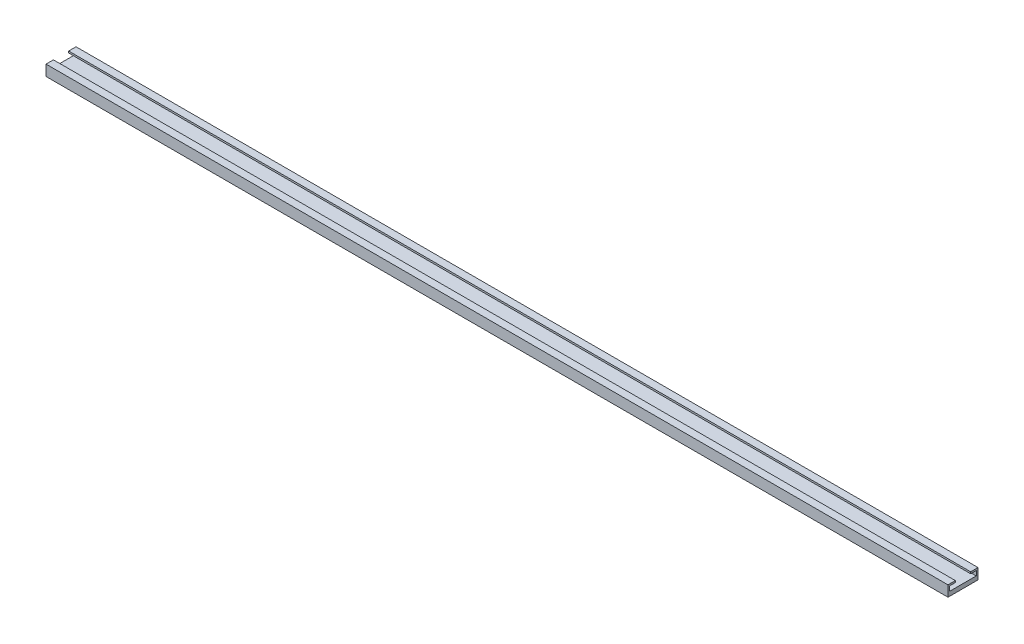
ISO-10303-21;
HEADER;
FILE_DESCRIPTION(('STEP AP214'),'2;1');
FILE_NAME('part.step','',(''),(''),'','','');
FILE_SCHEMA(('AUTOMOTIVE_DESIGN { 1 0 10303 214 1 1 1 1 }'));
ENDSEC;
DATA;
#1=APPLICATION_CONTEXT('core data for automotive mechanical design processes');
#2=APPLICATION_PROTOCOL_DEFINITION('international standard','automotive_design',2000,#1);
#3=PRODUCT_CONTEXT('',#1,'mechanical');
#4=PRODUCT('Part','Part','',(#3));
#5=PRODUCT_RELATED_PRODUCT_CATEGORY('part','',(#4));
#6=PRODUCT_DEFINITION_FORMATION('','',#4);
#7=PRODUCT_DEFINITION_CONTEXT('part definition',#1,'design');
#8=PRODUCT_DEFINITION('design','',#6,#7);
#9=PRODUCT_DEFINITION_SHAPE('','',#8);
#10=(LENGTH_UNIT() NAMED_UNIT(*) SI_UNIT(.MILLI.,.METRE.));
#11=(NAMED_UNIT(*) PLANE_ANGLE_UNIT() SI_UNIT($,.RADIAN.));
#12=(NAMED_UNIT(*) SI_UNIT($,.STERADIAN.) SOLID_ANGLE_UNIT());
#13=UNCERTAINTY_MEASURE_WITH_UNIT(LENGTH_MEASURE(1.E-05),#10,'distance_accuracy_value','');
#14=(GEOMETRIC_REPRESENTATION_CONTEXT(3) GLOBAL_UNCERTAINTY_ASSIGNED_CONTEXT((#13)) GLOBAL_UNIT_ASSIGNED_CONTEXT((#10,
#11,#12)) REPRESENTATION_CONTEXT('',''));
#15=CARTESIAN_POINT('',(0.,0.,0.));
#16=DIRECTION('',(0.,0.,1.));
#17=DIRECTION('',(1.,0.,0.));
#18=AXIS2_PLACEMENT_3D('',#15,#16,#17);
#19=CARTESIAN_POINT('',(1000.,3.7,4.4));
#20=DIRECTION('',(0.,-1.,0.));
#21=DIRECTION('',(0.,0.,-1.));
#22=AXIS2_PLACEMENT_3D('',#19,#20,#21);
#23=PLANE('',#22);
#24=DIRECTION('',(-1.,0.,0.));
#25=VECTOR('',#24,1.);
#26=CARTESIAN_POINT('',(1000.,3.7,8.65));
#27=LINE('',#26,#25);
#28=CARTESIAN_POINT('',(0.,3.7,8.65));
#29=VERTEX_POINT('',#28);
#30=CARTESIAN_POINT('',(-520.,3.7,8.65));
#31=VERTEX_POINT('',#30);
#32=EDGE_CURVE('E57',#29,#31,#27,.T.);
#33=ORIENTED_EDGE('',*,*,#32,.F.);
#34=DIRECTION('',(0.,0.,-1.));
#35=VECTOR('',#34,1.);
#36=CARTESIAN_POINT('',(0.,3.7,4.4));
#37=LINE('',#36,#35);
#38=CARTESIAN_POINT('',(0.,3.7,4.4));
#39=VERTEX_POINT('',#38);
#40=EDGE_CURVE('E263',#29,#39,#37,.T.);
#41=ORIENTED_EDGE('',*,*,#40,.T.);
#42=DIRECTION('',(-1.,0.,0.));
#43=VECTOR('',#42,1.);
#44=CARTESIAN_POINT('',(1000.,3.7,4.4));
#45=LINE('',#44,#43);
#46=CARTESIAN_POINT('',(-520.,3.7,4.4));
#47=VERTEX_POINT('',#46);
#48=EDGE_CURVE('E206',#39,#47,#45,.T.);
#49=ORIENTED_EDGE('',*,*,#48,.T.);
#50=DIRECTION('',(0.,0.,-1.));
#51=VECTOR('',#50,1.);
#52=CARTESIAN_POINT('',(-520.,3.7,8.65));
#53=LINE('',#52,#51);
#54=EDGE_CURVE('E257',#31,#47,#53,.T.);
#55=ORIENTED_EDGE('',*,*,#54,.F.);
#56=EDGE_LOOP('',(#33,#41,#49,#55));
#57=FACE_BOUND('',#56,.T.);
#58=ADVANCED_FACE('F53',(#57),#23,.F.);
#59=CARTESIAN_POINT('',(1000.,3.7,8.65));
#60=DIRECTION('',(0.,0.,-1.));
#61=DIRECTION('',(-1.,0.,0.));
#62=AXIS2_PLACEMENT_3D('',#59,#60,#61);
#63=PLANE('',#62);
#64=DIRECTION('',(-1.,0.,0.));
#65=VECTOR('',#64,1.);
#66=CARTESIAN_POINT('',(1000.,-2.5,8.65));
#67=LINE('',#66,#65);
#68=CARTESIAN_POINT('',(0.,-2.5,8.65));
#69=VERTEX_POINT('',#68);
#70=CARTESIAN_POINT('',(-520.,-2.5,8.65));
#71=VERTEX_POINT('',#70);
#72=EDGE_CURVE('E78',#69,#71,#67,.T.);
#73=ORIENTED_EDGE('',*,*,#72,.F.);
#74=DIRECTION('',(0.,1.,0.));
#75=VECTOR('',#74,1.);
#76=CARTESIAN_POINT('',(0.,3.7,8.65));
#77=LINE('',#76,#75);
#78=EDGE_CURVE('E72',#69,#29,#77,.T.);
#79=ORIENTED_EDGE('',*,*,#78,.T.);
#80=ORIENTED_EDGE('',*,*,#32,.T.);
#81=DIRECTION('',(0.,1.,0.));
#82=VECTOR('',#81,1.);
#83=CARTESIAN_POINT('',(-520.,-2.5,8.65));
#84=LINE('',#83,#82);
#85=EDGE_CURVE('E260',#71,#31,#84,.T.);
#86=ORIENTED_EDGE('',*,*,#85,.F.);
#87=EDGE_LOOP('',(#73,#79,#80,#86));
#88=FACE_BOUND('',#87,.T.);
#89=ADVANCED_FACE('F331',(#88),#63,.F.);
#90=CARTESIAN_POINT('',(1000.,2.7,4.4));
#91=DIRECTION('',(0.,0.,1.));
#92=DIRECTION('',(1.,0.,0.));
#93=AXIS2_PLACEMENT_3D('',#90,#91,#92);
#94=PLANE('',#93);
#95=ORIENTED_EDGE('',*,*,#48,.F.);
#96=DIRECTION('',(0.,-1.,0.));
#97=VECTOR('',#96,1.);
#98=CARTESIAN_POINT('',(0.,2.7,4.4));
#99=LINE('',#98,#97);
#100=CARTESIAN_POINT('',(0.,2.7,4.4));
#101=VERTEX_POINT('',#100);
#102=EDGE_CURVE('E268',#39,#101,#99,.T.);
#103=ORIENTED_EDGE('',*,*,#102,.T.);
#104=DIRECTION('',(-1.,0.,0.));
#105=VECTOR('',#104,1.);
#106=CARTESIAN_POINT('',(1000.,2.7,4.4));
#107=LINE('',#106,#105);
#108=CARTESIAN_POINT('',(-520.,2.7,4.4));
#109=VERTEX_POINT('',#108);
#110=EDGE_CURVE('E197',#101,#109,#107,.T.);
#111=ORIENTED_EDGE('',*,*,#110,.T.);
#112=DIRECTION('',(0.,-1.,0.));
#113=VECTOR('',#112,1.);
#114=CARTESIAN_POINT('',(-520.,3.7,4.4));
#115=LINE('',#114,#113);
#116=EDGE_CURVE('E253',#47,#109,#115,.T.);
#117=ORIENTED_EDGE('',*,*,#116,.F.);
#118=EDGE_LOOP('',(#95,#103,#111,#117));
#119=FACE_BOUND('',#118,.T.);
#120=ADVANCED_FACE('F320',(#119),#94,.F.);
#121=CARTESIAN_POINT('',(1000.,2.7,7.65));
#122=DIRECTION('',(0.,1.,0.));
#123=DIRECTION('',(0.,0.,1.));
#124=AXIS2_PLACEMENT_3D('',#121,#122,#123);
#125=PLANE('',#124);
#126=ORIENTED_EDGE('',*,*,#110,.F.);
#127=DIRECTION('',(0.,0.,1.));
#128=VECTOR('',#127,1.);
#129=CARTESIAN_POINT('',(0.,2.7,7.65));
#130=LINE('',#129,#128);
#131=CARTESIAN_POINT('',(0.,2.7,7.65));
#132=VERTEX_POINT('',#131);
#133=EDGE_CURVE('E272',#101,#132,#130,.T.);
#134=ORIENTED_EDGE('',*,*,#133,.T.);
#135=DIRECTION('',(-1.,0.,0.));
#136=VECTOR('',#135,1.);
#137=CARTESIAN_POINT('',(1000.,2.7,7.65));
#138=LINE('',#137,#136);
#139=CARTESIAN_POINT('',(-520.,2.7,7.65));
#140=VERTEX_POINT('',#139);
#141=EDGE_CURVE('E194',#132,#140,#138,.T.);
#142=ORIENTED_EDGE('',*,*,#141,.T.);
#143=DIRECTION('',(0.,0.,1.));
#144=VECTOR('',#143,1.);
#145=CARTESIAN_POINT('',(-520.,2.7,4.4));
#146=LINE('',#145,#144);
#147=EDGE_CURVE('E249',#109,#140,#146,.T.);
#148=ORIENTED_EDGE('',*,*,#147,.F.);
#149=EDGE_LOOP('',(#126,#134,#142,#148));
#150=FACE_BOUND('',#149,.T.);
#151=ADVANCED_FACE('F324',(#150),#125,.F.);
#152=CARTESIAN_POINT('',(1000.,0.,7.65));
#153=DIRECTION('',(0.,0.,1.));
#154=DIRECTION('',(1.,0.,0.));
#155=AXIS2_PLACEMENT_3D('',#152,#153,#154);
#156=PLANE('',#155);
#157=ORIENTED_EDGE('',*,*,#141,.F.);
#158=DIRECTION('',(0.,-1.,0.));
#159=VECTOR('',#158,1.);
#160=CARTESIAN_POINT('',(0.,0.,7.65));
#161=LINE('',#160,#159);
#162=CARTESIAN_POINT('',(0.,0.,7.65));
#163=VERTEX_POINT('',#162);
#164=EDGE_CURVE('E276',#132,#163,#161,.T.);
#165=ORIENTED_EDGE('',*,*,#164,.T.);
#166=DIRECTION('',(-1.,0.,0.));
#167=VECTOR('',#166,1.);
#168=CARTESIAN_POINT('',(1000.,0.,7.65));
#169=LINE('',#168,#167);
#170=CARTESIAN_POINT('',(-520.,0.,7.65));
#171=VERTEX_POINT('',#170);
#172=EDGE_CURVE('E191',#163,#171,#169,.T.);
#173=ORIENTED_EDGE('',*,*,#172,.T.);
#174=DIRECTION('',(0.,-1.,0.));
#175=VECTOR('',#174,1.);
#176=CARTESIAN_POINT('',(-520.,2.7,7.65));
#177=LINE('',#176,#175);
#178=EDGE_CURVE('E245',#140,#171,#177,.T.);
#179=ORIENTED_EDGE('',*,*,#178,.F.);
#180=EDGE_LOOP('',(#157,#165,#173,#179));
#181=FACE_BOUND('',#180,.T.);
#182=ADVANCED_FACE('F327',(#181),#156,.F.);
#183=CARTESIAN_POINT('',(1000.,0.,-7.65));
#184=DIRECTION('',(0.,-1.,0.));
#185=DIRECTION('',(0.,0.,-1.));
#186=AXIS2_PLACEMENT_3D('',#183,#184,#185);
#187=PLANE('',#186);
#188=ORIENTED_EDGE('',*,*,#172,.F.);
#189=DIRECTION('',(0.,0.,-1.));
#190=VECTOR('',#189,1.);
#191=CARTESIAN_POINT('',(0.,0.,-7.65));
#192=LINE('',#191,#190);
#193=CARTESIAN_POINT('',(0.,0.,-7.65));
#194=VERTEX_POINT('',#193);
#195=EDGE_CURVE('E280',#163,#194,#192,.T.);
#196=ORIENTED_EDGE('',*,*,#195,.T.);
#197=DIRECTION('',(-1.,0.,0.));
#198=VECTOR('',#197,1.);
#199=CARTESIAN_POINT('',(1000.,0.,-7.65));
#200=LINE('',#199,#198);
#201=CARTESIAN_POINT('',(-520.,0.,-7.65));
#202=VERTEX_POINT('',#201);
#203=EDGE_CURVE('E188',#194,#202,#200,.T.);
#204=ORIENTED_EDGE('',*,*,#203,.T.);
#205=DIRECTION('',(0.,0.,-1.));
#206=VECTOR('',#205,1.);
#207=CARTESIAN_POINT('',(-520.,0.,7.65));
#208=LINE('',#207,#206);
#209=EDGE_CURVE('E241',#171,#202,#208,.T.);
#210=ORIENTED_EDGE('',*,*,#209,.F.);
#211=EDGE_LOOP('',(#188,#196,#204,#210));
#212=FACE_BOUND('',#211,.T.);
#213=ADVANCED_FACE('F330',(#212),#187,.F.);
#214=CARTESIAN_POINT('',(1000.,2.7,-7.65));
#215=DIRECTION('',(0.,0.,-1.));
#216=DIRECTION('',(-1.,0.,0.));
#217=AXIS2_PLACEMENT_3D('',#214,#215,#216);
#218=PLANE('',#217);
#219=ORIENTED_EDGE('',*,*,#203,.F.);
#220=DIRECTION('',(0.,1.,0.));
#221=VECTOR('',#220,1.);
#222=CARTESIAN_POINT('',(0.,2.7,-7.65));
#223=LINE('',#222,#221);
#224=CARTESIAN_POINT('',(0.,2.7,-7.65));
#225=VERTEX_POINT('',#224);
#226=EDGE_CURVE('E284',#194,#225,#223,.T.);
#227=ORIENTED_EDGE('',*,*,#226,.T.);
#228=DIRECTION('',(-1.,0.,0.));
#229=VECTOR('',#228,1.);
#230=CARTESIAN_POINT('',(1000.,2.7,-7.65));
#231=LINE('',#230,#229);
#232=CARTESIAN_POINT('',(-520.,2.7,-7.65));
#233=VERTEX_POINT('',#232);
#234=EDGE_CURVE('E178',#225,#233,#231,.T.);
#235=ORIENTED_EDGE('',*,*,#234,.T.);
#236=DIRECTION('',(0.,1.,0.));
#237=VECTOR('',#236,1.);
#238=CARTESIAN_POINT('',(-520.,0.,-7.65));
#239=LINE('',#238,#237);
#240=EDGE_CURVE('E237',#202,#233,#239,.T.);
#241=ORIENTED_EDGE('',*,*,#240,.F.);
#242=EDGE_LOOP('',(#219,#227,#235,#241));
#243=FACE_BOUND('',#242,.T.);
#244=ADVANCED_FACE('F314',(#243),#218,.F.);
#245=CARTESIAN_POINT('',(1000.,2.7,-4.4));
#246=DIRECTION('',(0.,1.,0.));
#247=DIRECTION('',(0.,0.,1.));
#248=AXIS2_PLACEMENT_3D('',#245,#246,#247);
#249=PLANE('',#248);
#250=ORIENTED_EDGE('',*,*,#234,.F.);
#251=DIRECTION('',(0.,0.,1.));
#252=VECTOR('',#251,1.);
#253=CARTESIAN_POINT('',(0.,2.7,-4.4));
#254=LINE('',#253,#252);
#255=CARTESIAN_POINT('',(0.,2.7,-4.4));
#256=VERTEX_POINT('',#255);
#257=EDGE_CURVE('E288',#225,#256,#254,.T.);
#258=ORIENTED_EDGE('',*,*,#257,.T.);
#259=DIRECTION('',(-1.,0.,0.));
#260=VECTOR('',#259,1.);
#261=CARTESIAN_POINT('',(1000.,2.7,-4.4));
#262=LINE('',#261,#260);
#263=CARTESIAN_POINT('',(-520.,2.7,-4.4));
#264=VERTEX_POINT('',#263);
#265=EDGE_CURVE('E175',#256,#264,#262,.T.);
#266=ORIENTED_EDGE('',*,*,#265,.T.);
#267=DIRECTION('',(0.,0.,1.));
#268=VECTOR('',#267,1.);
#269=CARTESIAN_POINT('',(-520.,2.7,-7.65));
#270=LINE('',#269,#268);
#271=EDGE_CURVE('E233',#233,#264,#270,.T.);
#272=ORIENTED_EDGE('',*,*,#271,.F.);
#273=EDGE_LOOP('',(#250,#258,#266,#272));
#274=FACE_BOUND('',#273,.T.);
#275=ADVANCED_FACE('F308',(#274),#249,.F.);
#276=CARTESIAN_POINT('',(1000.,3.7,-4.4));
#277=DIRECTION('',(0.,0.,-1.));
#278=DIRECTION('',(-1.,0.,0.));
#279=AXIS2_PLACEMENT_3D('',#276,#277,#278);
#280=PLANE('',#279);
#281=ORIENTED_EDGE('',*,*,#265,.F.);
#282=DIRECTION('',(0.,1.,0.));
#283=VECTOR('',#282,1.);
#284=CARTESIAN_POINT('',(0.,3.7,-4.4));
#285=LINE('',#284,#283);
#286=CARTESIAN_POINT('',(0.,3.7,-4.4));
#287=VERTEX_POINT('',#286);
#288=EDGE_CURVE('E292',#256,#287,#285,.T.);
#289=ORIENTED_EDGE('',*,*,#288,.T.);
#290=DIRECTION('',(-1.,0.,0.));
#291=VECTOR('',#290,1.);
#292=CARTESIAN_POINT('',(1000.,3.7,-4.4));
#293=LINE('',#292,#291);
#294=CARTESIAN_POINT('',(-520.,3.7,-4.4));
#295=VERTEX_POINT('',#294);
#296=EDGE_CURVE('E161',#287,#295,#293,.T.);
#297=ORIENTED_EDGE('',*,*,#296,.T.);
#298=DIRECTION('',(0.,1.,0.));
#299=VECTOR('',#298,1.);
#300=CARTESIAN_POINT('',(-520.,2.7,-4.4));
#301=LINE('',#300,#299);
#302=EDGE_CURVE('E229',#264,#295,#301,.T.);
#303=ORIENTED_EDGE('',*,*,#302,.F.);
#304=EDGE_LOOP('',(#281,#289,#297,#303));
#305=FACE_BOUND('',#304,.T.);
#306=ADVANCED_FACE('F303',(#305),#280,.F.);
#307=CARTESIAN_POINT('',(1000.,3.7,-8.65));
#308=DIRECTION('',(0.,-1.,0.));
#309=DIRECTION('',(0.,0.,-1.));
#310=AXIS2_PLACEMENT_3D('',#307,#308,#309);
#311=PLANE('',#310);
#312=ORIENTED_EDGE('',*,*,#296,.F.);
#313=DIRECTION('',(0.,0.,-1.));
#314=VECTOR('',#313,1.);
#315=CARTESIAN_POINT('',(0.,3.7,-8.65));
#316=LINE('',#315,#314);
#317=CARTESIAN_POINT('',(0.,3.7,-8.65));
#318=VERTEX_POINT('',#317);
#319=EDGE_CURVE('E155',#287,#318,#316,.T.);
#320=ORIENTED_EDGE('',*,*,#319,.T.);
#321=DIRECTION('',(-1.,0.,0.));
#322=VECTOR('',#321,1.);
#323=CARTESIAN_POINT('',(1000.,3.7,-8.65));
#324=LINE('',#323,#322);
#325=CARTESIAN_POINT('',(-520.,3.7,-8.65));
#326=VERTEX_POINT('',#325);
#327=EDGE_CURVE('E153',#318,#326,#324,.T.);
#328=ORIENTED_EDGE('',*,*,#327,.T.);
#329=DIRECTION('',(0.,0.,-1.));
#330=VECTOR('',#329,1.);
#331=CARTESIAN_POINT('',(-520.,3.7,-4.4));
#332=LINE('',#331,#330);
#333=EDGE_CURVE('E223',#295,#326,#332,.T.);
#334=ORIENTED_EDGE('',*,*,#333,.F.);
#335=EDGE_LOOP('',(#312,#320,#328,#334));
#336=FACE_BOUND('',#335,.T.);
#337=ADVANCED_FACE('F299',(#336),#311,.F.);
#338=CARTESIAN_POINT('',(1000.,-2.5,-8.65));
#339=DIRECTION('',(0.,0.,1.));
#340=DIRECTION('',(1.,0.,0.));
#341=AXIS2_PLACEMENT_3D('',#338,#339,#340);
#342=PLANE('',#341);
#343=ORIENTED_EDGE('',*,*,#327,.F.);
#344=DIRECTION('',(0.,-1.,0.));
#345=VECTOR('',#344,1.);
#346=CARTESIAN_POINT('',(0.,-2.5,-8.65));
#347=LINE('',#346,#345);
#348=CARTESIAN_POINT('',(0.,-2.5,-8.65));
#349=VERTEX_POINT('',#348);
#350=EDGE_CURVE('E145',#318,#349,#347,.T.);
#351=ORIENTED_EDGE('',*,*,#350,.T.);
#352=DIRECTION('',(-1.,0.,0.));
#353=VECTOR('',#352,1.);
#354=CARTESIAN_POINT('',(1000.,-2.5,-8.65));
#355=LINE('',#354,#353);
#356=CARTESIAN_POINT('',(-520.,-2.5,-8.65));
#357=VERTEX_POINT('',#356);
#358=EDGE_CURVE('E64',#349,#357,#355,.T.);
#359=ORIENTED_EDGE('',*,*,#358,.T.);
#360=DIRECTION('',(0.,-1.,0.));
#361=VECTOR('',#360,1.);
#362=CARTESIAN_POINT('',(-520.,3.7,-8.65));
#363=LINE('',#362,#361);
#364=EDGE_CURVE('E219',#326,#357,#363,.T.);
#365=ORIENTED_EDGE('',*,*,#364,.F.);
#366=EDGE_LOOP('',(#343,#351,#359,#365));
#367=FACE_BOUND('',#366,.T.);
#368=ADVANCED_FACE('F150',(#367),#342,.F.);
#369=CARTESIAN_POINT('',(1000.,-2.5,8.65));
#370=DIRECTION('',(0.,1.,0.));
#371=DIRECTION('',(0.,0.,1.));
#372=AXIS2_PLACEMENT_3D('',#369,#370,#371);
#373=PLANE('',#372);
#374=ORIENTED_EDGE('',*,*,#358,.F.);
#375=DIRECTION('',(0.,0.,1.));
#376=VECTOR('',#375,1.);
#377=CARTESIAN_POINT('',(0.,-2.5,8.65));
#378=LINE('',#377,#376);
#379=EDGE_CURVE('E11',#349,#69,#378,.T.);
#380=ORIENTED_EDGE('',*,*,#379,.T.);
#381=ORIENTED_EDGE('',*,*,#72,.T.);
#382=DIRECTION('',(0.,0.,1.));
#383=VECTOR('',#382,1.);
#384=CARTESIAN_POINT('',(-520.,-2.5,-8.65));
#385=LINE('',#384,#383);
#386=EDGE_CURVE('E157',#357,#71,#385,.T.);
#387=ORIENTED_EDGE('',*,*,#386,.F.);
#388=EDGE_LOOP('',(#374,#380,#381,#387));
#389=FACE_BOUND('',#388,.T.);
#390=ADVANCED_FACE('F55',(#389),#373,.F.);
#391=CARTESIAN_POINT('',(-520.,0.,0.));
#392=DIRECTION('',(-1.,0.,0.));
#393=DIRECTION('',(0.,0.,1.));
#394=AXIS2_PLACEMENT_3D('',#391,#392,#393);
#395=PLANE('',#394);
#396=ORIENTED_EDGE('',*,*,#85,.T.);
#397=ORIENTED_EDGE('',*,*,#54,.T.);
#398=ORIENTED_EDGE('',*,*,#116,.T.);
#399=ORIENTED_EDGE('',*,*,#147,.T.);
#400=ORIENTED_EDGE('',*,*,#178,.T.);
#401=ORIENTED_EDGE('',*,*,#209,.T.);
#402=ORIENTED_EDGE('',*,*,#240,.T.);
#403=ORIENTED_EDGE('',*,*,#271,.T.);
#404=ORIENTED_EDGE('',*,*,#302,.T.);
#405=ORIENTED_EDGE('',*,*,#333,.T.);
#406=ORIENTED_EDGE('',*,*,#364,.T.);
#407=ORIENTED_EDGE('',*,*,#386,.T.);
#408=EDGE_LOOP('',(#396,#397,#398,#399,#400,#401,#402,#403,#404,#405,#406,#407));
#409=FACE_BOUND('',#408,.T.);
#410=ADVANCED_FACE('F309',(#409),#395,.T.);
#411=CARTESIAN_POINT('',(0.,0.,0.));
#412=DIRECTION('',(-1.,0.,0.));
#413=DIRECTION('',(0.,0.,1.));
#414=AXIS2_PLACEMENT_3D('',#411,#412,#413);
#415=PLANE('',#414);
#416=ORIENTED_EDGE('',*,*,#78,.F.);
#417=ORIENTED_EDGE('',*,*,#379,.F.);
#418=ORIENTED_EDGE('',*,*,#350,.F.);
#419=ORIENTED_EDGE('',*,*,#319,.F.);
#420=ORIENTED_EDGE('',*,*,#288,.F.);
#421=ORIENTED_EDGE('',*,*,#257,.F.);
#422=ORIENTED_EDGE('',*,*,#226,.F.);
#423=ORIENTED_EDGE('',*,*,#195,.F.);
#424=ORIENTED_EDGE('',*,*,#164,.F.);
#425=ORIENTED_EDGE('',*,*,#133,.F.);
#426=ORIENTED_EDGE('',*,*,#102,.F.);
#427=ORIENTED_EDGE('',*,*,#40,.F.);
#428=EDGE_LOOP('',(#416,#417,#418,#419,#420,#421,#422,#423,#424,#425,#426,#427));
#429=FACE_BOUND('',#428,.T.);
#430=ADVANCED_FACE('F144',(#429),#415,.F.);
#431=CLOSED_SHELL('',(#58,#89,#120,#151,#182,#213,#244,#275,#306,#337,#368,#390,#410,#430));
#432=MANIFOLD_SOLID_BREP('B2',#431);
#433=ADVANCED_BREP_SHAPE_REPRESENTATION('',(#18,#432),#14);
#434=SHAPE_DEFINITION_REPRESENTATION(#9,#433);
ENDSEC;
END-ISO-10303-21;
